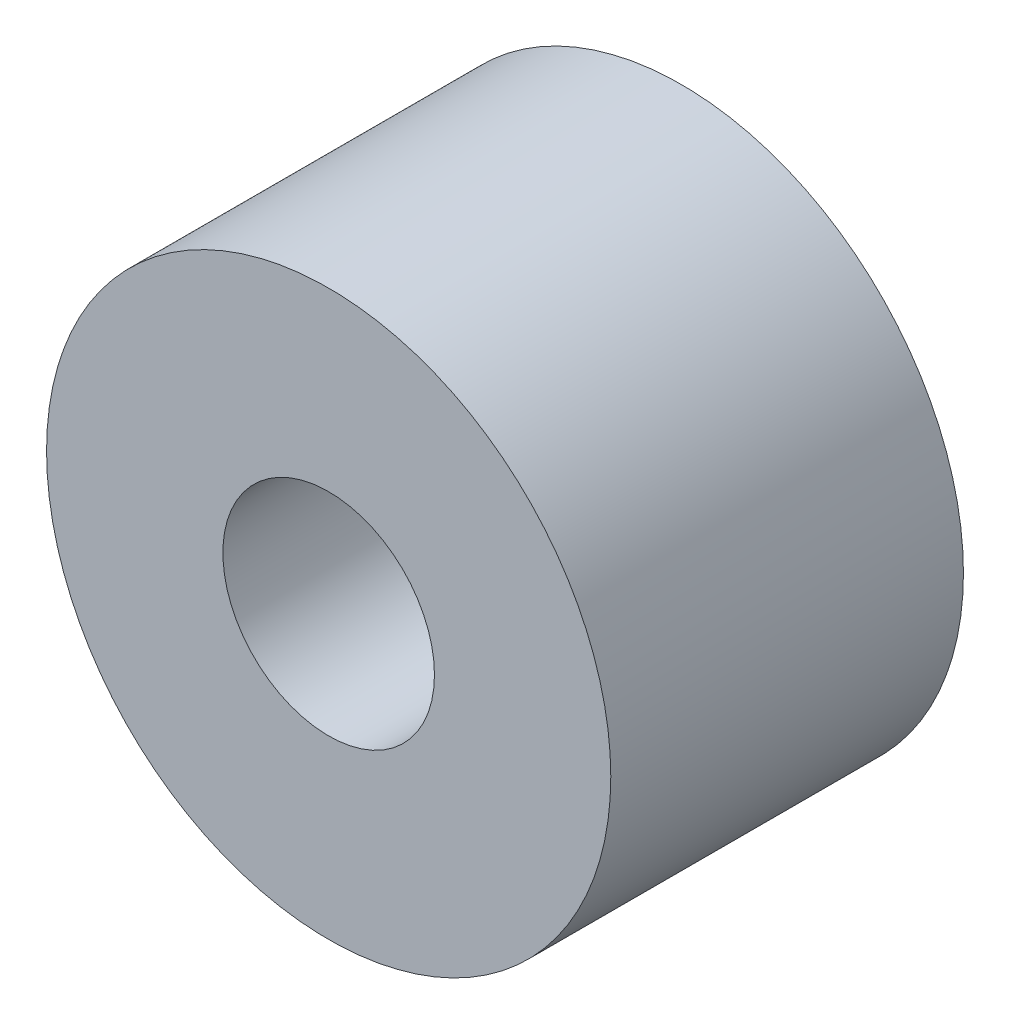
ISO-10303-21;
HEADER;
FILE_DESCRIPTION(('STEP AP214'),'2;1');
FILE_NAME('part.step','',(''),(''),'','','');
FILE_SCHEMA(('AUTOMOTIVE_DESIGN { 1 0 10303 214 1 1 1 1 }'));
ENDSEC;
DATA;
#1=APPLICATION_CONTEXT('core data for automotive mechanical design processes');
#2=APPLICATION_PROTOCOL_DEFINITION('international standard','automotive_design',2000,#1);
#3=PRODUCT_CONTEXT('',#1,'mechanical');
#4=PRODUCT('Part','Part','',(#3));
#5=PRODUCT_RELATED_PRODUCT_CATEGORY('part','',(#4));
#6=PRODUCT_DEFINITION_FORMATION('','',#4);
#7=PRODUCT_DEFINITION_CONTEXT('part definition',#1,'design');
#8=PRODUCT_DEFINITION('design','',#6,#7);
#9=PRODUCT_DEFINITION_SHAPE('','',#8);
#10=(LENGTH_UNIT() NAMED_UNIT(*) SI_UNIT(.MILLI.,.METRE.));
#11=(NAMED_UNIT(*) PLANE_ANGLE_UNIT() SI_UNIT($,.RADIAN.));
#12=(NAMED_UNIT(*) SI_UNIT($,.STERADIAN.) SOLID_ANGLE_UNIT());
#13=UNCERTAINTY_MEASURE_WITH_UNIT(LENGTH_MEASURE(1.E-05),#10,'distance_accuracy_value','');
#14=(GEOMETRIC_REPRESENTATION_CONTEXT(3) GLOBAL_UNCERTAINTY_ASSIGNED_CONTEXT((#13)) GLOBAL_UNIT_ASSIGNED_CONTEXT((#10,
#11,#12)) REPRESENTATION_CONTEXT('',''));
#15=CARTESIAN_POINT('',(0.,0.,0.));
#16=DIRECTION('',(0.,0.,1.));
#17=DIRECTION('',(1.,0.,0.));
#18=AXIS2_PLACEMENT_3D('',#15,#16,#17);
#19=CARTESIAN_POINT('',(0.,0.,5.));
#20=DIRECTION('',(0.,0.,1.));
#21=DIRECTION('',(1.,0.,0.));
#22=AXIS2_PLACEMENT_3D('',#19,#20,#21);
#23=PLANE('',#22);
#24=CARTESIAN_POINT('',(0.,0.,5.));
#25=DIRECTION('',(0.,0.,1.));
#26=DIRECTION('',(1.,0.,0.));
#27=AXIS2_PLACEMENT_3D('',#24,#25,#26);
#28=CIRCLE('',#27,4.);
#29=CARTESIAN_POINT('',(4.,0.,5.));
#30=VERTEX_POINT('',#29);
#31=EDGE_CURVE('E10',#30,#30,#28,.T.);
#32=ORIENTED_EDGE('',*,*,#31,.T.);
#33=EDGE_LOOP('',(#32));
#34=FACE_BOUND('',#33,.T.);
#35=CARTESIAN_POINT('',(0.,0.,5.));
#36=DIRECTION('',(0.,0.,1.));
#37=DIRECTION('',(1.,0.,0.));
#38=AXIS2_PLACEMENT_3D('',#35,#36,#37);
#39=CIRCLE('',#38,1.5);
#40=CARTESIAN_POINT('',(1.5,0.,5.));
#41=VERTEX_POINT('',#40);
#42=EDGE_CURVE('E48',#41,#41,#39,.T.);
#43=ORIENTED_EDGE('',*,*,#42,.F.);
#44=EDGE_LOOP('',(#43));
#45=FACE_BOUND('',#44,.T.);
#46=ADVANCED_FACE('F40',(#34,#45),#23,.T.);
#47=CARTESIAN_POINT('',(0.,0.,0.));
#48=DIRECTION('',(0.,0.,1.));
#49=DIRECTION('',(1.,0.,0.));
#50=AXIS2_PLACEMENT_3D('',#47,#48,#49);
#51=PLANE('',#50);
#52=CARTESIAN_POINT('',(0.,0.,0.));
#53=DIRECTION('',(0.,0.,1.));
#54=DIRECTION('',(1.,0.,0.));
#55=AXIS2_PLACEMENT_3D('',#52,#53,#54);
#56=CIRCLE('',#55,4.);
#57=CARTESIAN_POINT('',(4.,0.,0.));
#58=VERTEX_POINT('',#57);
#59=EDGE_CURVE('E41',#58,#58,#56,.T.);
#60=ORIENTED_EDGE('',*,*,#59,.F.);
#61=EDGE_LOOP('',(#60));
#62=FACE_BOUND('',#61,.T.);
#63=CARTESIAN_POINT('',(0.,0.,0.));
#64=DIRECTION('',(0.,0.,1.));
#65=DIRECTION('',(1.,0.,0.));
#66=AXIS2_PLACEMENT_3D('',#63,#64,#65);
#67=CIRCLE('',#66,1.5);
#68=CARTESIAN_POINT('',(1.5,0.,0.));
#69=VERTEX_POINT('',#68);
#70=EDGE_CURVE('E49',#69,#69,#67,.T.);
#71=ORIENTED_EDGE('',*,*,#70,.T.);
#72=EDGE_LOOP('',(#71));
#73=FACE_BOUND('',#72,.T.);
#74=ADVANCED_FACE('F58',(#62,#73),#51,.F.);
#75=CARTESIAN_POINT('',(0.,0.,5.));
#76=DIRECTION('',(0.,0.,-1.));
#77=DIRECTION('',(-1.,0.,0.));
#78=AXIS2_PLACEMENT_3D('',#75,#76,#77);
#79=CYLINDRICAL_SURFACE('',#78,4.);
#80=ORIENTED_EDGE('',*,*,#31,.F.);
#81=EDGE_LOOP('',(#80));
#82=FACE_BOUND('',#81,.T.);
#83=ORIENTED_EDGE('',*,*,#59,.T.);
#84=EDGE_LOOP('',(#83));
#85=FACE_BOUND('',#84,.T.);
#86=ADVANCED_FACE('F39',(#82,#85),#79,.T.);
#87=CARTESIAN_POINT('',(0.,0.,5.));
#88=DIRECTION('',(0.,0.,-1.));
#89=DIRECTION('',(-1.,0.,0.));
#90=AXIS2_PLACEMENT_3D('',#87,#88,#89);
#91=CYLINDRICAL_SURFACE('',#90,1.5);
#92=ORIENTED_EDGE('',*,*,#42,.T.);
#93=EDGE_LOOP('',(#92));
#94=FACE_BOUND('',#93,.T.);
#95=ORIENTED_EDGE('',*,*,#70,.F.);
#96=EDGE_LOOP('',(#95));
#97=FACE_BOUND('',#96,.T.);
#98=ADVANCED_FACE('F57',(#94,#97),#91,.F.);
#99=CLOSED_SHELL('',(#46,#74,#86,#98));
#100=MANIFOLD_SOLID_BREP('B2',#99);
#101=ADVANCED_BREP_SHAPE_REPRESENTATION('',(#18,#100),#14);
#102=SHAPE_DEFINITION_REPRESENTATION(#9,#101);
ENDSEC;
END-ISO-10303-21;
